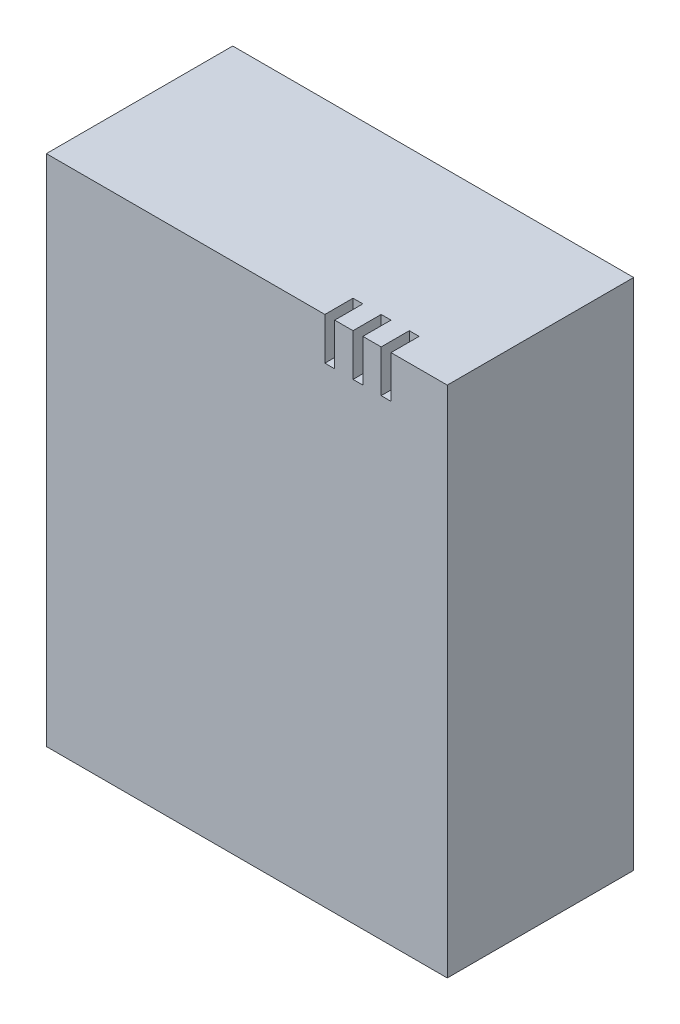
ISO-10303-21;
HEADER;
FILE_DESCRIPTION(('STEP AP214'),'2;1');
FILE_NAME('part.step','',(''),(''),'','','');
FILE_SCHEMA(('AUTOMOTIVE_DESIGN { 1 0 10303 214 1 1 1 1 }'));
ENDSEC;
DATA;
#1=APPLICATION_CONTEXT('core data for automotive mechanical design processes');
#2=APPLICATION_PROTOCOL_DEFINITION('international standard','automotive_design',2000,#1);
#3=PRODUCT_CONTEXT('',#1,'mechanical');
#4=PRODUCT('Part','Part','',(#3));
#5=PRODUCT_RELATED_PRODUCT_CATEGORY('part','',(#4));
#6=PRODUCT_DEFINITION_FORMATION('','',#4);
#7=PRODUCT_DEFINITION_CONTEXT('part definition',#1,'design');
#8=PRODUCT_DEFINITION('design','',#6,#7);
#9=PRODUCT_DEFINITION_SHAPE('','',#8);
#10=(LENGTH_UNIT() NAMED_UNIT(*) SI_UNIT(.MILLI.,.METRE.));
#11=(NAMED_UNIT(*) PLANE_ANGLE_UNIT() SI_UNIT($,.RADIAN.));
#12=(NAMED_UNIT(*) SI_UNIT($,.STERADIAN.) SOLID_ANGLE_UNIT());
#13=UNCERTAINTY_MEASURE_WITH_UNIT(LENGTH_MEASURE(1.E-05),#10,'distance_accuracy_value','');
#14=(GEOMETRIC_REPRESENTATION_CONTEXT(3) GLOBAL_UNCERTAINTY_ASSIGNED_CONTEXT((#13)) GLOBAL_UNIT_ASSIGNED_CONTEXT((#10,
#11,#12)) REPRESENTATION_CONTEXT('',''));
#15=CARTESIAN_POINT('',(0.,0.,0.));
#16=DIRECTION('',(0.,0.,1.));
#17=DIRECTION('',(1.,0.,0.));
#18=AXIS2_PLACEMENT_3D('',#15,#16,#17);
#19=CARTESIAN_POINT('',(14.25,36.5,6.625));
#20=DIRECTION('',(-1.,0.,0.));
#21=DIRECTION('',(0.,0.,1.));
#22=AXIS2_PLACEMENT_3D('',#19,#20,#21);
#23=PLANE('',#22);
#24=DIRECTION('',(0.,0.,-1.));
#25=VECTOR('',#24,1.);
#26=CARTESIAN_POINT('',(14.25,0.,6.625));
#27=LINE('',#26,#25);
#28=CARTESIAN_POINT('',(14.25,0.,6.625));
#29=VERTEX_POINT('',#28);
#30=CARTESIAN_POINT('',(14.25,0.,-6.625));
#31=VERTEX_POINT('',#30);
#32=EDGE_CURVE('E226',#29,#31,#27,.T.);
#33=ORIENTED_EDGE('',*,*,#32,.T.);
#34=DIRECTION('',(0.,-1.,0.));
#35=VECTOR('',#34,1.);
#36=CARTESIAN_POINT('',(14.25,36.5,-6.625));
#37=LINE('',#36,#35);
#38=CARTESIAN_POINT('',(14.25,36.5,-6.625));
#39=VERTEX_POINT('',#38);
#40=EDGE_CURVE('E11',#39,#31,#37,.T.);
#41=ORIENTED_EDGE('',*,*,#40,.F.);
#42=DIRECTION('',(0.,0.,-1.));
#43=VECTOR('',#42,1.);
#44=CARTESIAN_POINT('',(14.25,36.5,6.625));
#45=LINE('',#44,#43);
#46=CARTESIAN_POINT('',(14.25,36.5,6.625));
#47=VERTEX_POINT('',#46);
#48=EDGE_CURVE('E234',#47,#39,#45,.T.);
#49=ORIENTED_EDGE('',*,*,#48,.F.);
#50=DIRECTION('',(0.,-1.,0.));
#51=VECTOR('',#50,1.);
#52=CARTESIAN_POINT('',(14.25,36.5,6.625));
#53=LINE('',#52,#51);
#54=EDGE_CURVE('E246',#47,#29,#53,.T.);
#55=ORIENTED_EDGE('',*,*,#54,.T.);
#56=EDGE_LOOP('',(#33,#41,#49,#55));
#57=FACE_BOUND('',#56,.T.);
#58=ADVANCED_FACE('F34',(#57),#23,.F.);
#59=CARTESIAN_POINT('',(-14.25,36.5,-6.625));
#60=DIRECTION('',(0.,0.,1.));
#61=DIRECTION('',(1.,0.,0.));
#62=AXIS2_PLACEMENT_3D('',#59,#60,#61);
#63=PLANE('',#62);
#64=DIRECTION('',(-1.,0.,0.));
#65=VECTOR('',#64,1.);
#66=CARTESIAN_POINT('',(-14.25,0.,-6.625));
#67=LINE('',#66,#65);
#68=CARTESIAN_POINT('',(-14.25,0.,-6.625));
#69=VERTEX_POINT('',#68);
#70=EDGE_CURVE('E249',#31,#69,#67,.T.);
#71=ORIENTED_EDGE('',*,*,#70,.T.);
#72=DIRECTION('',(0.,-1.,0.));
#73=VECTOR('',#72,1.);
#74=CARTESIAN_POINT('',(-14.25,36.5,-6.625));
#75=LINE('',#74,#73);
#76=CARTESIAN_POINT('',(-14.25,36.5,-6.625));
#77=VERTEX_POINT('',#76);
#78=EDGE_CURVE('E41',#77,#69,#75,.T.);
#79=ORIENTED_EDGE('',*,*,#78,.F.);
#80=DIRECTION('',(-1.,0.,0.));
#81=VECTOR('',#80,1.);
#82=CARTESIAN_POINT('',(-14.25,36.5,-6.625));
#83=LINE('',#82,#81);
#84=EDGE_CURVE('E237',#39,#77,#83,.T.);
#85=ORIENTED_EDGE('',*,*,#84,.F.);
#86=ORIENTED_EDGE('',*,*,#40,.T.);
#87=EDGE_LOOP('',(#71,#79,#85,#86));
#88=FACE_BOUND('',#87,.T.);
#89=ADVANCED_FACE('F319',(#88),#63,.F.);
#90=CARTESIAN_POINT('',(-14.25,36.5,6.625));
#91=DIRECTION('',(1.,0.,0.));
#92=DIRECTION('',(0.,0.,-1.));
#93=AXIS2_PLACEMENT_3D('',#90,#91,#92);
#94=PLANE('',#93);
#95=DIRECTION('',(0.,0.,1.));
#96=VECTOR('',#95,1.);
#97=CARTESIAN_POINT('',(-14.25,0.,6.625));
#98=LINE('',#97,#96);
#99=CARTESIAN_POINT('',(-14.25,0.,6.625));
#100=VERTEX_POINT('',#99);
#101=EDGE_CURVE('E251',#69,#100,#98,.T.);
#102=ORIENTED_EDGE('',*,*,#101,.T.);
#103=DIRECTION('',(0.,-1.,0.));
#104=VECTOR('',#103,1.);
#105=CARTESIAN_POINT('',(-14.25,36.5,6.625));
#106=LINE('',#105,#104);
#107=CARTESIAN_POINT('',(-14.25,36.5,6.625));
#108=VERTEX_POINT('',#107);
#109=EDGE_CURVE('E256',#108,#100,#106,.T.);
#110=ORIENTED_EDGE('',*,*,#109,.F.);
#111=DIRECTION('',(0.,0.,1.));
#112=VECTOR('',#111,1.);
#113=CARTESIAN_POINT('',(-14.25,36.5,6.625));
#114=LINE('',#113,#112);
#115=EDGE_CURVE('E240',#77,#108,#114,.T.);
#116=ORIENTED_EDGE('',*,*,#115,.F.);
#117=ORIENTED_EDGE('',*,*,#78,.T.);
#118=EDGE_LOOP('',(#102,#110,#116,#117));
#119=FACE_BOUND('',#118,.T.);
#120=ADVANCED_FACE('F263',(#119),#94,.F.);
#121=CARTESIAN_POINT('',(-14.25,36.5,6.625));
#122=DIRECTION('',(0.,0.,-1.));
#123=DIRECTION('',(-1.,0.,0.));
#124=AXIS2_PLACEMENT_3D('',#121,#122,#123);
#125=PLANE('',#124);
#126=DIRECTION('',(1.,0.,0.));
#127=VECTOR('',#126,1.);
#128=CARTESIAN_POINT('',(6.25,33.5,6.62500000000003));
#129=LINE('',#128,#127);
#130=CARTESIAN_POINT('',(5.55,33.5,6.62500000000003));
#131=VERTEX_POINT('',#130);
#132=CARTESIAN_POINT('',(6.25,33.5,6.62500000000003));
#133=VERTEX_POINT('',#132);
#134=EDGE_CURVE('E154',#131,#133,#129,.T.);
#135=ORIENTED_EDGE('',*,*,#134,.F.);
#136=DIRECTION('',(0.,1.,0.));
#137=VECTOR('',#136,1.);
#138=CARTESIAN_POINT('',(5.55,33.5,6.62500000000003));
#139=LINE('',#138,#137);
#140=CARTESIAN_POINT('',(5.55,36.5,6.62500000000003));
#141=VERTEX_POINT('',#140);
#142=EDGE_CURVE('E191',#131,#141,#139,.T.);
#143=ORIENTED_EDGE('',*,*,#142,.T.);
#144=DIRECTION('',(1.,0.,0.));
#145=VECTOR('',#144,1.);
#146=CARTESIAN_POINT('',(-14.25,36.5,6.625));
#147=LINE('',#146,#145);
#148=EDGE_CURVE('E243',#108,#141,#147,.T.);
#149=ORIENTED_EDGE('',*,*,#148,.F.);
#150=ORIENTED_EDGE('',*,*,#109,.T.);
#151=DIRECTION('',(1.,0.,0.));
#152=VECTOR('',#151,1.);
#153=CARTESIAN_POINT('',(-14.25,0.,6.625));
#154=LINE('',#153,#152);
#155=EDGE_CURVE('E238',#100,#29,#154,.T.);
#156=ORIENTED_EDGE('',*,*,#155,.T.);
#157=ORIENTED_EDGE('',*,*,#54,.F.);
#158=CARTESIAN_POINT('',(10.25,36.5,6.625));
#159=VERTEX_POINT('',#158);
#160=EDGE_CURVE('E242',#159,#47,#147,.T.);
#161=ORIENTED_EDGE('',*,*,#160,.F.);
#162=DIRECTION('',(0.,1.,0.));
#163=VECTOR('',#162,1.);
#164=CARTESIAN_POINT('',(10.25,33.5,6.625));
#165=LINE('',#164,#163);
#166=CARTESIAN_POINT('',(10.25,33.5,6.625));
#167=VERTEX_POINT('',#166);
#168=EDGE_CURVE('E224',#167,#159,#165,.T.);
#169=ORIENTED_EDGE('',*,*,#168,.F.);
#170=DIRECTION('',(1.,0.,0.));
#171=VECTOR('',#170,1.);
#172=CARTESIAN_POINT('',(10.25,33.5,6.625));
#173=LINE('',#172,#171);
#174=CARTESIAN_POINT('',(9.55,33.5,6.625));
#175=VERTEX_POINT('',#174);
#176=EDGE_CURVE('E214',#175,#167,#173,.T.);
#177=ORIENTED_EDGE('',*,*,#176,.F.);
#178=DIRECTION('',(0.,1.,0.));
#179=VECTOR('',#178,1.);
#180=CARTESIAN_POINT('',(9.55,33.5,6.625));
#181=LINE('',#180,#179);
#182=CARTESIAN_POINT('',(9.55,36.5,6.625));
#183=VERTEX_POINT('',#182);
#184=EDGE_CURVE('E227',#175,#183,#181,.T.);
#185=ORIENTED_EDGE('',*,*,#184,.T.);
#186=CARTESIAN_POINT('',(8.24999999999999,36.5,6.625));
#187=VERTEX_POINT('',#186);
#188=EDGE_CURVE('E281',#187,#183,#147,.T.);
#189=ORIENTED_EDGE('',*,*,#188,.F.);
#190=DIRECTION('',(0.,1.,0.));
#191=VECTOR('',#190,1.);
#192=CARTESIAN_POINT('',(8.25,33.5,6.62500000000001));
#193=LINE('',#192,#191);
#194=CARTESIAN_POINT('',(8.25,33.5,6.62500000000001));
#195=VERTEX_POINT('',#194);
#196=EDGE_CURVE('E56',#195,#187,#193,.T.);
#197=ORIENTED_EDGE('',*,*,#196,.F.);
#198=DIRECTION('',(1.,0.,0.));
#199=VECTOR('',#198,1.);
#200=CARTESIAN_POINT('',(8.25,33.5,6.62500000000001));
#201=LINE('',#200,#199);
#202=CARTESIAN_POINT('',(7.55,33.5,6.62500000000001));
#203=VERTEX_POINT('',#202);
#204=EDGE_CURVE('E175',#203,#195,#201,.T.);
#205=ORIENTED_EDGE('',*,*,#204,.F.);
#206=DIRECTION('',(0.,1.,0.));
#207=VECTOR('',#206,1.);
#208=CARTESIAN_POINT('',(7.55,33.5,6.62500000000001));
#209=LINE('',#208,#207);
#210=CARTESIAN_POINT('',(7.55,36.5,6.62500000000001));
#211=VERTEX_POINT('',#210);
#212=EDGE_CURVE('E196',#203,#211,#209,.T.);
#213=ORIENTED_EDGE('',*,*,#212,.T.);
#214=CARTESIAN_POINT('',(6.24999999999999,36.5,6.625));
#215=VERTEX_POINT('',#214);
#216=EDGE_CURVE('E168',#215,#211,#147,.T.);
#217=ORIENTED_EDGE('',*,*,#216,.F.);
#218=DIRECTION('',(0.,1.,0.));
#219=VECTOR('',#218,1.);
#220=CARTESIAN_POINT('',(6.25,33.5,6.62500000000003));
#221=LINE('',#220,#219);
#222=EDGE_CURVE('E48',#133,#215,#221,.T.);
#223=ORIENTED_EDGE('',*,*,#222,.F.);
#224=EDGE_LOOP('',(#135,#143,#149,#150,#156,#157,#161,#169,#177,#185,#189,#197,#205,#213,#217,#223));
#225=FACE_BOUND('',#224,.T.);
#226=ADVANCED_FACE('F166',(#225),#125,.F.);
#227=CARTESIAN_POINT('',(0.,36.5,0.));
#228=DIRECTION('',(0.,-1.,0.));
#229=DIRECTION('',(0.,0.,-1.));
#230=AXIS2_PLACEMENT_3D('',#227,#228,#229);
#231=PLANE('',#230);
#232=ORIENTED_EDGE('',*,*,#148,.T.);
#233=DIRECTION('',(0.,0.,1.));
#234=VECTOR('',#233,1.);
#235=CARTESIAN_POINT('',(5.55,36.5,6.62500000000003));
#236=LINE('',#235,#234);
#237=CARTESIAN_POINT('',(5.55,36.5,4.62500000000003));
#238=VERTEX_POINT('',#237);
#239=EDGE_CURVE('E163',#238,#141,#236,.T.);
#240=ORIENTED_EDGE('',*,*,#239,.F.);
#241=DIRECTION('',(-1.,0.,0.));
#242=VECTOR('',#241,1.);
#243=CARTESIAN_POINT('',(6.25,36.5,4.62500000000003));
#244=LINE('',#243,#242);
#245=CARTESIAN_POINT('',(6.25,36.5,4.62500000000003));
#246=VERTEX_POINT('',#245);
#247=EDGE_CURVE('E457',#246,#238,#244,.T.);
#248=ORIENTED_EDGE('',*,*,#247,.F.);
#249=DIRECTION('',(0.,0.,-1.));
#250=VECTOR('',#249,1.);
#251=CARTESIAN_POINT('',(6.25,36.5,6.62500000000003));
#252=LINE('',#251,#250);
#253=EDGE_CURVE('E287',#215,#246,#252,.T.);
#254=ORIENTED_EDGE('',*,*,#253,.F.);
#255=ORIENTED_EDGE('',*,*,#216,.T.);
#256=DIRECTION('',(0.,0.,1.));
#257=VECTOR('',#256,1.);
#258=CARTESIAN_POINT('',(7.55,36.5,6.62500000000001));
#259=LINE('',#258,#257);
#260=CARTESIAN_POINT('',(7.55,36.5,4.62500000000001));
#261=VERTEX_POINT('',#260);
#262=EDGE_CURVE('E179',#261,#211,#259,.T.);
#263=ORIENTED_EDGE('',*,*,#262,.F.);
#264=DIRECTION('',(-1.,0.,0.));
#265=VECTOR('',#264,1.);
#266=CARTESIAN_POINT('',(8.25,36.5,4.62500000000001));
#267=LINE('',#266,#265);
#268=CARTESIAN_POINT('',(8.25,36.5,4.62500000000001));
#269=VERTEX_POINT('',#268);
#270=EDGE_CURVE('E190',#269,#261,#267,.T.);
#271=ORIENTED_EDGE('',*,*,#270,.F.);
#272=DIRECTION('',(0.,0.,-1.));
#273=VECTOR('',#272,1.);
#274=CARTESIAN_POINT('',(8.25,36.5,6.62500000000001));
#275=LINE('',#274,#273);
#276=EDGE_CURVE('E188',#187,#269,#275,.T.);
#277=ORIENTED_EDGE('',*,*,#276,.F.);
#278=ORIENTED_EDGE('',*,*,#188,.T.);
#279=DIRECTION('',(0.,0.,1.));
#280=VECTOR('',#279,1.);
#281=CARTESIAN_POINT('',(9.55,36.5,6.625));
#282=LINE('',#281,#280);
#283=CARTESIAN_POINT('',(9.55,36.5,4.625));
#284=VERTEX_POINT('',#283);
#285=EDGE_CURVE('E208',#284,#183,#282,.T.);
#286=ORIENTED_EDGE('',*,*,#285,.F.);
#287=DIRECTION('',(-1.,0.,0.));
#288=VECTOR('',#287,1.);
#289=CARTESIAN_POINT('',(10.25,36.5,4.625));
#290=LINE('',#289,#288);
#291=CARTESIAN_POINT('',(10.25,36.5,4.625));
#292=VERTEX_POINT('',#291);
#293=EDGE_CURVE('E219',#292,#284,#290,.T.);
#294=ORIENTED_EDGE('',*,*,#293,.F.);
#295=DIRECTION('',(0.,0.,-1.));
#296=VECTOR('',#295,1.);
#297=CARTESIAN_POINT('',(10.25,36.5,6.625));
#298=LINE('',#297,#296);
#299=EDGE_CURVE('E198',#159,#292,#298,.T.);
#300=ORIENTED_EDGE('',*,*,#299,.F.);
#301=ORIENTED_EDGE('',*,*,#160,.T.);
#302=ORIENTED_EDGE('',*,*,#48,.T.);
#303=ORIENTED_EDGE('',*,*,#84,.T.);
#304=ORIENTED_EDGE('',*,*,#115,.T.);
#305=EDGE_LOOP('',(#232,#240,#248,#254,#255,#263,#271,#277,#278,#286,#294,#300,#301,#302,#303,#304));
#306=FACE_BOUND('',#305,.T.);
#307=ADVANCED_FACE('F277',(#306),#231,.F.);
#308=CARTESIAN_POINT('',(0.,0.,0.));
#309=DIRECTION('',(0.,-1.,0.));
#310=DIRECTION('',(0.,0.,-1.));
#311=AXIS2_PLACEMENT_3D('',#308,#309,#310);
#312=PLANE('',#311);
#313=ORIENTED_EDGE('',*,*,#32,.F.);
#314=ORIENTED_EDGE('',*,*,#155,.F.);
#315=ORIENTED_EDGE('',*,*,#101,.F.);
#316=ORIENTED_EDGE('',*,*,#70,.F.);
#317=EDGE_LOOP('',(#313,#314,#315,#316));
#318=FACE_BOUND('',#317,.T.);
#319=ADVANCED_FACE('F269',(#318),#312,.T.);
#320=CARTESIAN_POINT('',(10.25,33.5,6.625));
#321=DIRECTION('',(1.,0.,0.));
#322=DIRECTION('',(0.,0.,-1.));
#323=AXIS2_PLACEMENT_3D('',#320,#321,#322);
#324=PLANE('',#323);
#325=ORIENTED_EDGE('',*,*,#299,.T.);
#326=DIRECTION('',(0.,1.,0.));
#327=VECTOR('',#326,1.);
#328=CARTESIAN_POINT('',(10.25,33.5,4.625));
#329=LINE('',#328,#327);
#330=CARTESIAN_POINT('',(10.25,33.5,4.625));
#331=VERTEX_POINT('',#330);
#332=EDGE_CURVE('E217',#331,#292,#329,.T.);
#333=ORIENTED_EDGE('',*,*,#332,.F.);
#334=DIRECTION('',(0.,0.,-1.));
#335=VECTOR('',#334,1.);
#336=CARTESIAN_POINT('',(10.25,33.5,6.625));
#337=LINE('',#336,#335);
#338=EDGE_CURVE('E204',#167,#331,#337,.T.);
#339=ORIENTED_EDGE('',*,*,#338,.F.);
#340=ORIENTED_EDGE('',*,*,#168,.T.);
#341=EDGE_LOOP('',(#325,#333,#339,#340));
#342=FACE_BOUND('',#341,.T.);
#343=ADVANCED_FACE('F307',(#342),#324,.F.);
#344=CARTESIAN_POINT('',(9.55,33.5,6.625));
#345=DIRECTION('',(-1.,0.,0.));
#346=DIRECTION('',(0.,0.,1.));
#347=AXIS2_PLACEMENT_3D('',#344,#345,#346);
#348=PLANE('',#347);
#349=ORIENTED_EDGE('',*,*,#285,.T.);
#350=ORIENTED_EDGE('',*,*,#184,.F.);
#351=DIRECTION('',(0.,0.,1.));
#352=VECTOR('',#351,1.);
#353=CARTESIAN_POINT('',(9.55,33.5,6.625));
#354=LINE('',#353,#352);
#355=CARTESIAN_POINT('',(9.55,33.5,4.625));
#356=VERTEX_POINT('',#355);
#357=EDGE_CURVE('E211',#356,#175,#354,.T.);
#358=ORIENTED_EDGE('',*,*,#357,.F.);
#359=DIRECTION('',(0.,1.,0.));
#360=VECTOR('',#359,1.);
#361=CARTESIAN_POINT('',(9.55,33.5,4.625));
#362=LINE('',#361,#360);
#363=EDGE_CURVE('E230',#356,#284,#362,.T.);
#364=ORIENTED_EDGE('',*,*,#363,.T.);
#365=EDGE_LOOP('',(#349,#350,#358,#364));
#366=FACE_BOUND('',#365,.T.);
#367=ADVANCED_FACE('F300',(#366),#348,.F.);
#368=CARTESIAN_POINT('',(10.25,33.5,4.625));
#369=DIRECTION('',(0.,0.,-1.));
#370=DIRECTION('',(-1.,0.,0.));
#371=AXIS2_PLACEMENT_3D('',#368,#369,#370);
#372=PLANE('',#371);
#373=ORIENTED_EDGE('',*,*,#293,.T.);
#374=ORIENTED_EDGE('',*,*,#363,.F.);
#375=DIRECTION('',(-1.,0.,0.));
#376=VECTOR('',#375,1.);
#377=CARTESIAN_POINT('',(10.25,33.5,4.625));
#378=LINE('',#377,#376);
#379=EDGE_CURVE('E207',#331,#356,#378,.T.);
#380=ORIENTED_EDGE('',*,*,#379,.F.);
#381=ORIENTED_EDGE('',*,*,#332,.T.);
#382=EDGE_LOOP('',(#373,#374,#380,#381));
#383=FACE_BOUND('',#382,.T.);
#384=ADVANCED_FACE('F305',(#383),#372,.F.);
#385=CARTESIAN_POINT('',(0.,33.5,0.));
#386=DIRECTION('',(0.,1.,0.));
#387=DIRECTION('',(0.,0.,1.));
#388=AXIS2_PLACEMENT_3D('',#385,#386,#387);
#389=PLANE('',#388);
#390=ORIENTED_EDGE('',*,*,#338,.T.);
#391=ORIENTED_EDGE('',*,*,#379,.T.);
#392=ORIENTED_EDGE('',*,*,#357,.T.);
#393=ORIENTED_EDGE('',*,*,#176,.T.);
#394=EDGE_LOOP('',(#390,#391,#392,#393));
#395=FACE_BOUND('',#394,.T.);
#396=ADVANCED_FACE('F302',(#395),#389,.T.);
#397=CARTESIAN_POINT('',(7.55,33.5,6.62500000000001));
#398=DIRECTION('',(-1.,0.,0.));
#399=DIRECTION('',(0.,0.,1.));
#400=AXIS2_PLACEMENT_3D('',#397,#398,#399);
#401=PLANE('',#400);
#402=ORIENTED_EDGE('',*,*,#262,.T.);
#403=ORIENTED_EDGE('',*,*,#212,.F.);
#404=DIRECTION('',(0.,0.,1.));
#405=VECTOR('',#404,1.);
#406=CARTESIAN_POINT('',(7.55,33.5,6.62500000000001));
#407=LINE('',#406,#405);
#408=CARTESIAN_POINT('',(7.55,33.5,4.62500000000001));
#409=VERTEX_POINT('',#408);
#410=EDGE_CURVE('E185',#409,#203,#407,.T.);
#411=ORIENTED_EDGE('',*,*,#410,.F.);
#412=DIRECTION('',(0.,1.,0.));
#413=VECTOR('',#412,1.);
#414=CARTESIAN_POINT('',(7.55,33.5,4.62500000000001));
#415=LINE('',#414,#413);
#416=EDGE_CURVE('E199',#409,#261,#415,.T.);
#417=ORIENTED_EDGE('',*,*,#416,.T.);
#418=EDGE_LOOP('',(#402,#403,#411,#417));
#419=FACE_BOUND('',#418,.T.);
#420=ADVANCED_FACE('F289',(#419),#401,.F.);
#421=CARTESIAN_POINT('',(8.25,33.5,4.62500000000001));
#422=DIRECTION('',(0.,0.,-1.));
#423=DIRECTION('',(-1.,0.,0.));
#424=AXIS2_PLACEMENT_3D('',#421,#422,#423);
#425=PLANE('',#424);
#426=ORIENTED_EDGE('',*,*,#270,.T.);
#427=ORIENTED_EDGE('',*,*,#416,.F.);
#428=DIRECTION('',(-1.,0.,0.));
#429=VECTOR('',#428,1.);
#430=CARTESIAN_POINT('',(8.25,33.5,4.62500000000001));
#431=LINE('',#430,#429);
#432=CARTESIAN_POINT('',(8.25,33.5,4.62500000000001));
#433=VERTEX_POINT('',#432);
#434=EDGE_CURVE('E182',#433,#409,#431,.T.);
#435=ORIENTED_EDGE('',*,*,#434,.F.);
#436=DIRECTION('',(0.,1.,0.));
#437=VECTOR('',#436,1.);
#438=CARTESIAN_POINT('',(8.25,33.5,4.62500000000001));
#439=LINE('',#438,#437);
#440=EDGE_CURVE('E201',#433,#269,#439,.T.);
#441=ORIENTED_EDGE('',*,*,#440,.T.);
#442=EDGE_LOOP('',(#426,#427,#435,#441));
#443=FACE_BOUND('',#442,.T.);
#444=ADVANCED_FACE('F296',(#443),#425,.F.);
#445=CARTESIAN_POINT('',(8.25,33.5,6.62500000000001));
#446=DIRECTION('',(1.,0.,0.));
#447=DIRECTION('',(0.,0.,-1.));
#448=AXIS2_PLACEMENT_3D('',#445,#446,#447);
#449=PLANE('',#448);
#450=ORIENTED_EDGE('',*,*,#276,.T.);
#451=ORIENTED_EDGE('',*,*,#440,.F.);
#452=DIRECTION('',(0.,0.,-1.));
#453=VECTOR('',#452,1.);
#454=CARTESIAN_POINT('',(8.25,33.5,6.62500000000001));
#455=LINE('',#454,#453);
#456=EDGE_CURVE('E178',#195,#433,#455,.T.);
#457=ORIENTED_EDGE('',*,*,#456,.F.);
#458=ORIENTED_EDGE('',*,*,#196,.T.);
#459=EDGE_LOOP('',(#450,#451,#457,#458));
#460=FACE_BOUND('',#459,.T.);
#461=ADVANCED_FACE('F397',(#460),#449,.F.);
#462=CARTESIAN_POINT('',(0.,33.5,0.));
#463=DIRECTION('',(0.,-1.,0.));
#464=DIRECTION('',(0.,0.,-1.));
#465=AXIS2_PLACEMENT_3D('',#462,#463,#464);
#466=PLANE('',#465);
#467=ORIENTED_EDGE('',*,*,#204,.T.);
#468=ORIENTED_EDGE('',*,*,#456,.T.);
#469=ORIENTED_EDGE('',*,*,#434,.T.);
#470=ORIENTED_EDGE('',*,*,#410,.T.);
#471=EDGE_LOOP('',(#467,#468,#469,#470));
#472=FACE_BOUND('',#471,.T.);
#473=ADVANCED_FACE('F293',(#472),#466,.F.);
#474=CARTESIAN_POINT('',(5.55,33.5,6.62500000000003));
#475=DIRECTION('',(-1.,0.,0.));
#476=DIRECTION('',(0.,0.,1.));
#477=AXIS2_PLACEMENT_3D('',#474,#475,#476);
#478=PLANE('',#477);
#479=ORIENTED_EDGE('',*,*,#239,.T.);
#480=ORIENTED_EDGE('',*,*,#142,.F.);
#481=DIRECTION('',(0.,0.,1.));
#482=VECTOR('',#481,1.);
#483=CARTESIAN_POINT('',(5.55,33.5,6.62500000000003));
#484=LINE('',#483,#482);
#485=CARTESIAN_POINT('',(5.55,33.5,4.62500000000003));
#486=VERTEX_POINT('',#485);
#487=EDGE_CURVE('E160',#486,#131,#484,.T.);
#488=ORIENTED_EDGE('',*,*,#487,.F.);
#489=DIRECTION('',(0.,1.,0.));
#490=VECTOR('',#489,1.);
#491=CARTESIAN_POINT('',(5.55,33.5,4.62500000000003));
#492=LINE('',#491,#490);
#493=EDGE_CURVE('E170',#486,#238,#492,.T.);
#494=ORIENTED_EDGE('',*,*,#493,.T.);
#495=EDGE_LOOP('',(#479,#480,#488,#494));
#496=FACE_BOUND('',#495,.T.);
#497=ADVANCED_FACE('F412',(#496),#478,.F.);
#498=CARTESIAN_POINT('',(6.25,33.5,4.62500000000003));
#499=DIRECTION('',(0.,0.,-1.));
#500=DIRECTION('',(-1.,0.,0.));
#501=AXIS2_PLACEMENT_3D('',#498,#499,#500);
#502=PLANE('',#501);
#503=ORIENTED_EDGE('',*,*,#247,.T.);
#504=ORIENTED_EDGE('',*,*,#493,.F.);
#505=DIRECTION('',(-1.,0.,0.));
#506=VECTOR('',#505,1.);
#507=CARTESIAN_POINT('',(6.25,33.5,4.62500000000003));
#508=LINE('',#507,#506);
#509=CARTESIAN_POINT('',(6.25,33.5,4.62500000000003));
#510=VERTEX_POINT('',#509);
#511=EDGE_CURVE('E153',#510,#486,#508,.T.);
#512=ORIENTED_EDGE('',*,*,#511,.F.);
#513=DIRECTION('',(0.,1.,0.));
#514=VECTOR('',#513,1.);
#515=CARTESIAN_POINT('',(6.25,33.5,4.62500000000003));
#516=LINE('',#515,#514);
#517=EDGE_CURVE('E149',#510,#246,#516,.T.);
#518=ORIENTED_EDGE('',*,*,#517,.T.);
#519=EDGE_LOOP('',(#503,#504,#512,#518));
#520=FACE_BOUND('',#519,.T.);
#521=ADVANCED_FACE('F420',(#520),#502,.F.);
#522=CARTESIAN_POINT('',(6.25,33.5,6.62500000000003));
#523=DIRECTION('',(1.,0.,0.));
#524=DIRECTION('',(0.,0.,-1.));
#525=AXIS2_PLACEMENT_3D('',#522,#523,#524);
#526=PLANE('',#525);
#527=ORIENTED_EDGE('',*,*,#253,.T.);
#528=ORIENTED_EDGE('',*,*,#517,.F.);
#529=DIRECTION('',(0.,0.,-1.));
#530=VECTOR('',#529,1.);
#531=CARTESIAN_POINT('',(6.25,33.5,6.62500000000003));
#532=LINE('',#531,#530);
#533=EDGE_CURVE('E146',#133,#510,#532,.T.);
#534=ORIENTED_EDGE('',*,*,#533,.F.);
#535=ORIENTED_EDGE('',*,*,#222,.T.);
#536=EDGE_LOOP('',(#527,#528,#534,#535));
#537=FACE_BOUND('',#536,.T.);
#538=ADVANCED_FACE('F148',(#537),#526,.F.);
#539=CARTESIAN_POINT('',(0.,33.5,0.));
#540=DIRECTION('',(0.,-1.,0.));
#541=DIRECTION('',(0.,0.,-1.));
#542=AXIS2_PLACEMENT_3D('',#539,#540,#541);
#543=PLANE('',#542);
#544=ORIENTED_EDGE('',*,*,#134,.T.);
#545=ORIENTED_EDGE('',*,*,#533,.T.);
#546=ORIENTED_EDGE('',*,*,#511,.T.);
#547=ORIENTED_EDGE('',*,*,#487,.T.);
#548=EDGE_LOOP('',(#544,#545,#546,#547));
#549=FACE_BOUND('',#548,.T.);
#550=ADVANCED_FACE('F158',(#549),#543,.F.);
#551=CLOSED_SHELL('',(#58,#89,#120,#226,#307,#319,#343,#367,#384,#396,#420,#444,#461,#473,#497,
#521,#538,#550));
#552=MANIFOLD_SOLID_BREP('B2',#551);
#553=ADVANCED_BREP_SHAPE_REPRESENTATION('',(#18,#552),#14);
#554=SHAPE_DEFINITION_REPRESENTATION(#9,#553);
ENDSEC;
END-ISO-10303-21;
